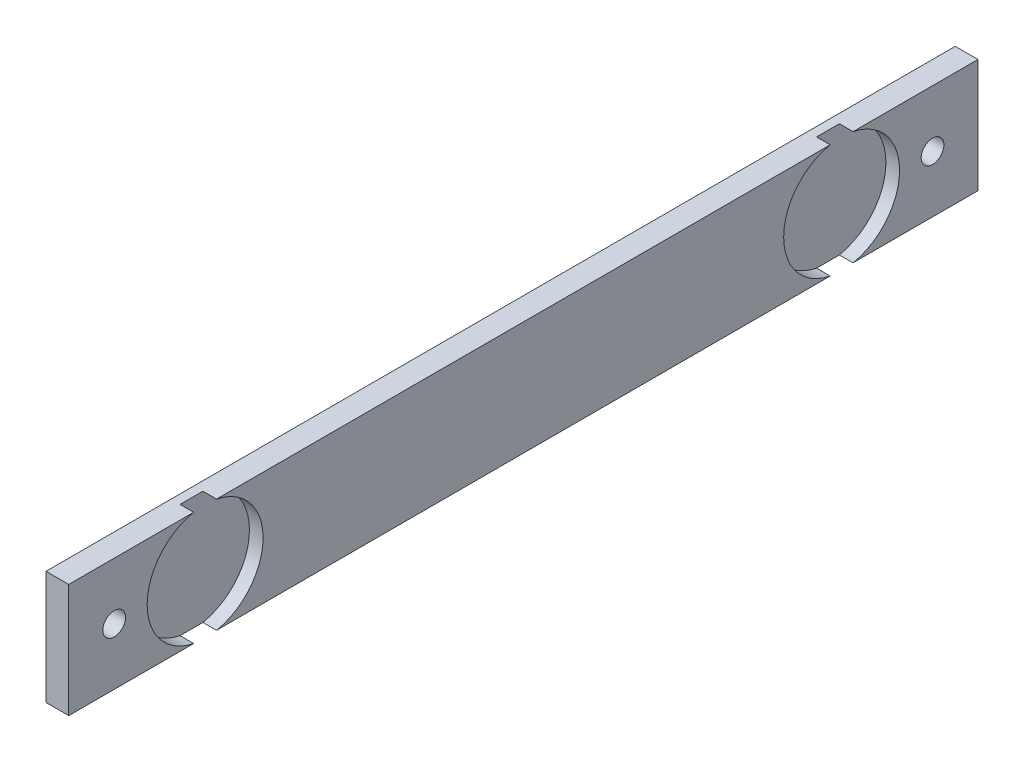
ISO-10303-21;
HEADER;
FILE_DESCRIPTION(('STEP AP214'),'2;1');
FILE_NAME('part.step','',(''),(''),'','','');
FILE_SCHEMA(('AUTOMOTIVE_DESIGN { 1 0 10303 214 1 1 1 1 }'));
ENDSEC;
DATA;
#1=APPLICATION_CONTEXT('core data for automotive mechanical design processes');
#2=APPLICATION_PROTOCOL_DEFINITION('international standard','automotive_design',2000,#1);
#3=PRODUCT_CONTEXT('',#1,'mechanical');
#4=PRODUCT('Part','Part','',(#3));
#5=PRODUCT_RELATED_PRODUCT_CATEGORY('part','',(#4));
#6=PRODUCT_DEFINITION_FORMATION('','',#4);
#7=PRODUCT_DEFINITION_CONTEXT('part definition',#1,'design');
#8=PRODUCT_DEFINITION('design','',#6,#7);
#9=PRODUCT_DEFINITION_SHAPE('','',#8);
#10=(LENGTH_UNIT() NAMED_UNIT(*) SI_UNIT(.MILLI.,.METRE.));
#11=(NAMED_UNIT(*) PLANE_ANGLE_UNIT() SI_UNIT($,.RADIAN.));
#12=(NAMED_UNIT(*) SI_UNIT($,.STERADIAN.) SOLID_ANGLE_UNIT());
#13=UNCERTAINTY_MEASURE_WITH_UNIT(LENGTH_MEASURE(1.E-05),#10,'distance_accuracy_value','');
#14=(GEOMETRIC_REPRESENTATION_CONTEXT(3) GLOBAL_UNCERTAINTY_ASSIGNED_CONTEXT((#13)) GLOBAL_UNIT_ASSIGNED_CONTEXT((#10,
#11,#12)) REPRESENTATION_CONTEXT('',''));
#15=CARTESIAN_POINT('',(0.,0.,0.));
#16=DIRECTION('',(0.,0.,1.));
#17=DIRECTION('',(1.,0.,0.));
#18=AXIS2_PLACEMENT_3D('',#15,#16,#17);
#19=CARTESIAN_POINT('',(2.,0.,0.));
#20=DIRECTION('',(1.,0.,0.));
#21=DIRECTION('',(0.,0.,-1.));
#22=AXIS2_PLACEMENT_3D('',#19,#20,#21);
#23=PLANE('',#22);
#24=CARTESIAN_POINT('',(2.,4.99999999999999,68.));
#25=DIRECTION('',(1.,0.,0.));
#26=DIRECTION('',(0.,0.,-1.));
#27=AXIS2_PLACEMENT_3D('',#24,#25,#26);
#28=CIRCLE('',#27,5.1);
#29=CARTESIAN_POINT('',(2.,9.99999999999998,69.0049875621121));
#30=VERTEX_POINT('',#29);
#31=CARTESIAN_POINT('',(2.,0.,69.004987562112));
#32=VERTEX_POINT('',#31);
#33=EDGE_CURVE('E204',#30,#32,#28,.T.);
#34=ORIENTED_EDGE('',*,*,#33,.F.);
#35=DIRECTION('',(0.,0.,1.));
#36=VECTOR('',#35,1.);
#37=CARTESIAN_POINT('',(2.,10.,0.));
#38=LINE('',#37,#36);
#39=CARTESIAN_POINT('',(2.,9.99999999999998,80.));
#40=VERTEX_POINT('',#39);
#41=EDGE_CURVE('E170',#30,#40,#38,.T.);
#42=ORIENTED_EDGE('',*,*,#41,.T.);
#43=DIRECTION('',(0.,-1.,0.));
#44=VECTOR('',#43,1.);
#45=CARTESIAN_POINT('',(2.,0.,80.));
#46=LINE('',#45,#44);
#47=CARTESIAN_POINT('',(2.,0.,80.));
#48=VERTEX_POINT('',#47);
#49=EDGE_CURVE('E174',#40,#48,#46,.T.);
#50=ORIENTED_EDGE('',*,*,#49,.T.);
#51=DIRECTION('',(0.,0.,-1.));
#52=VECTOR('',#51,1.);
#53=CARTESIAN_POINT('',(2.,0.,0.));
#54=LINE('',#53,#52);
#55=EDGE_CURVE('E178',#48,#32,#54,.T.);
#56=ORIENTED_EDGE('',*,*,#55,.T.);
#57=EDGE_LOOP('',(#34,#42,#50,#56));
#58=FACE_BOUND('',#57,.T.);
#59=CARTESIAN_POINT('',(2.,4.99999999999998,76.));
#60=DIRECTION('',(1.,0.,0.));
#61=DIRECTION('',(0.,0.,-1.));
#62=AXIS2_PLACEMENT_3D('',#59,#60,#61);
#63=CIRCLE('',#62,0.999999999999998);
#64=CARTESIAN_POINT('',(2.,4.99999999999998,75.));
#65=VERTEX_POINT('',#64);
#66=EDGE_CURVE('E159',#65,#65,#63,.T.);
#67=ORIENTED_EDGE('',*,*,#66,.F.);
#68=EDGE_LOOP('',(#67));
#69=FACE_BOUND('',#68,.T.);
#70=ADVANCED_FACE('F35',(#58,#69),#23,.T.);
#71=CARTESIAN_POINT('',(2.,0.,66.995012437888));
#72=VERTEX_POINT('',#71);
#73=CARTESIAN_POINT('',(2.,9.99999999999998,66.9950124378879));
#74=VERTEX_POINT('',#73);
#75=EDGE_CURVE('E203',#72,#74,#28,.T.);
#76=ORIENTED_EDGE('',*,*,#75,.F.);
#77=CARTESIAN_POINT('',(2.,0.,13.0049875621121));
#78=VERTEX_POINT('',#77);
#79=EDGE_CURVE('E182',#72,#78,#54,.T.);
#80=ORIENTED_EDGE('',*,*,#79,.T.);
#81=CARTESIAN_POINT('',(2.,5.,12.));
#82=DIRECTION('',(1.,0.,0.));
#83=DIRECTION('',(0.,0.,-1.));
#84=AXIS2_PLACEMENT_3D('',#81,#82,#83);
#85=CIRCLE('',#84,5.1);
#86=CARTESIAN_POINT('',(2.,9.99999999999999,13.0049875621121));
#87=VERTEX_POINT('',#86);
#88=EDGE_CURVE('E202',#87,#78,#85,.T.);
#89=ORIENTED_EDGE('',*,*,#88,.F.);
#90=EDGE_CURVE('E175',#87,#74,#38,.T.);
#91=ORIENTED_EDGE('',*,*,#90,.T.);
#92=EDGE_LOOP('',(#76,#80,#89,#91));
#93=FACE_BOUND('',#92,.T.);
#94=ADVANCED_FACE('F241',(#93),#23,.T.);
#95=CARTESIAN_POINT('',(2.,0.,0.));
#96=DIRECTION('',(0.,0.,1.));
#97=DIRECTION('',(0.,-1.,0.));
#98=AXIS2_PLACEMENT_3D('',#95,#96,#97);
#99=PLANE('',#98);
#100=DIRECTION('',(0.,1.,0.));
#101=VECTOR('',#100,1.);
#102=CARTESIAN_POINT('',(0.,0.,0.));
#103=LINE('',#102,#101);
#104=CARTESIAN_POINT('',(0.,0.,0.));
#105=VERTEX_POINT('',#104);
#106=CARTESIAN_POINT('',(0.,10.,0.));
#107=VERTEX_POINT('',#106);
#108=EDGE_CURVE('E158',#105,#107,#103,.T.);
#109=ORIENTED_EDGE('',*,*,#108,.T.);
#110=DIRECTION('',(-1.,0.,0.));
#111=VECTOR('',#110,1.);
#112=CARTESIAN_POINT('',(2.,10.,0.));
#113=LINE('',#112,#111);
#114=CARTESIAN_POINT('',(2.,10.,0.));
#115=VERTEX_POINT('',#114);
#116=EDGE_CURVE('E198',#115,#107,#113,.T.);
#117=ORIENTED_EDGE('',*,*,#116,.F.);
#118=DIRECTION('',(0.,1.,0.));
#119=VECTOR('',#118,1.);
#120=CARTESIAN_POINT('',(2.,0.,0.));
#121=LINE('',#120,#119);
#122=CARTESIAN_POINT('',(2.,0.,0.));
#123=VERTEX_POINT('',#122);
#124=EDGE_CURVE('E167',#123,#115,#121,.T.);
#125=ORIENTED_EDGE('',*,*,#124,.F.);
#126=DIRECTION('',(-1.,0.,0.));
#127=VECTOR('',#126,1.);
#128=CARTESIAN_POINT('',(2.,0.,0.));
#129=LINE('',#128,#127);
#130=EDGE_CURVE('E181',#123,#105,#129,.T.);
#131=ORIENTED_EDGE('',*,*,#130,.T.);
#132=EDGE_LOOP('',(#109,#117,#125,#131));
#133=FACE_BOUND('',#132,.T.);
#134=ADVANCED_FACE('F37',(#133),#99,.F.);
#135=CARTESIAN_POINT('',(2.,10.,0.));
#136=DIRECTION('',(0.,-1.,0.));
#137=DIRECTION('',(0.,0.,-1.));
#138=AXIS2_PLACEMENT_3D('',#135,#136,#137);
#139=PLANE('',#138);
#140=DIRECTION('',(0.,0.,1.));
#141=VECTOR('',#140,1.);
#142=CARTESIAN_POINT('',(0.8,10.,0.));
#143=LINE('',#142,#141);
#144=CARTESIAN_POINT('',(0.8,9.99999999999998,66.9950124378879));
#145=VERTEX_POINT('',#144);
#146=CARTESIAN_POINT('',(0.8,9.99999999999998,69.0049875621121));
#147=VERTEX_POINT('',#146);
#148=EDGE_CURVE('E145',#145,#147,#143,.T.);
#149=ORIENTED_EDGE('',*,*,#148,.F.);
#150=DIRECTION('',(1.,0.,0.));
#151=VECTOR('',#150,1.);
#152=CARTESIAN_POINT('',(0.8,9.99999999999998,66.9950124378879));
#153=LINE('',#152,#151);
#154=EDGE_CURVE('E146',#145,#74,#153,.T.);
#155=ORIENTED_EDGE('',*,*,#154,.T.);
#156=ORIENTED_EDGE('',*,*,#90,.F.);
#157=DIRECTION('',(1.,0.,0.));
#158=VECTOR('',#157,1.);
#159=CARTESIAN_POINT('',(0.8,9.99999999999999,13.0049875621121));
#160=LINE('',#159,#158);
#161=CARTESIAN_POINT('',(0.8,9.99999999999999,13.0049875621121));
#162=VERTEX_POINT('',#161);
#163=EDGE_CURVE('E131',#87,#162,#160,.F.);
#164=ORIENTED_EDGE('',*,*,#163,.T.);
#165=DIRECTION('',(0.,0.,1.));
#166=VECTOR('',#165,1.);
#167=CARTESIAN_POINT('',(0.8,10.,0.));
#168=LINE('',#167,#166);
#169=CARTESIAN_POINT('',(0.8,9.99999999999999,10.9950124378879));
#170=VERTEX_POINT('',#169);
#171=EDGE_CURVE('E136',#170,#162,#168,.T.);
#172=ORIENTED_EDGE('',*,*,#171,.F.);
#173=DIRECTION('',(1.,0.,0.));
#174=VECTOR('',#173,1.);
#175=CARTESIAN_POINT('',(0.8,9.99999999999999,10.9950124378879));
#176=LINE('',#175,#174);
#177=CARTESIAN_POINT('',(2.,9.99999999999999,10.9950124378879));
#178=VERTEX_POINT('',#177);
#179=EDGE_CURVE('E123',#170,#178,#176,.T.);
#180=ORIENTED_EDGE('',*,*,#179,.T.);
#181=EDGE_CURVE('E172',#115,#178,#38,.T.);
#182=ORIENTED_EDGE('',*,*,#181,.F.);
#183=ORIENTED_EDGE('',*,*,#116,.T.);
#184=DIRECTION('',(0.,0.,1.));
#185=VECTOR('',#184,1.);
#186=CARTESIAN_POINT('',(0.,10.,0.));
#187=LINE('',#186,#185);
#188=CARTESIAN_POINT('',(0.,9.99999999999998,80.));
#189=VERTEX_POINT('',#188);
#190=EDGE_CURVE('E185',#107,#189,#187,.T.);
#191=ORIENTED_EDGE('',*,*,#190,.T.);
#192=DIRECTION('',(-1.,0.,0.));
#193=VECTOR('',#192,1.);
#194=CARTESIAN_POINT('',(2.,9.99999999999998,80.));
#195=LINE('',#194,#193);
#196=EDGE_CURVE('E195',#40,#189,#195,.T.);
#197=ORIENTED_EDGE('',*,*,#196,.F.);
#198=ORIENTED_EDGE('',*,*,#41,.F.);
#199=DIRECTION('',(1.,0.,0.));
#200=VECTOR('',#199,1.);
#201=CARTESIAN_POINT('',(0.8,9.99999999999998,69.0049875621121));
#202=LINE('',#201,#200);
#203=EDGE_CURVE('E151',#30,#147,#202,.F.);
#204=ORIENTED_EDGE('',*,*,#203,.T.);
#205=EDGE_LOOP('',(#149,#155,#156,#164,#172,#180,#182,#183,#191,#197,#198,#204));
#206=FACE_BOUND('',#205,.T.);
#207=ADVANCED_FACE('F143',(#206),#139,.F.);
#208=CARTESIAN_POINT('',(2.,0.,80.));
#209=DIRECTION('',(0.,0.,-1.));
#210=DIRECTION('',(-1.,0.,0.));
#211=AXIS2_PLACEMENT_3D('',#208,#209,#210);
#212=PLANE('',#211);
#213=DIRECTION('',(0.,-1.,0.));
#214=VECTOR('',#213,1.);
#215=CARTESIAN_POINT('',(0.,0.,80.));
#216=LINE('',#215,#214);
#217=CARTESIAN_POINT('',(0.,0.,80.));
#218=VERTEX_POINT('',#217);
#219=EDGE_CURVE('E187',#189,#218,#216,.T.);
#220=ORIENTED_EDGE('',*,*,#219,.T.);
#221=DIRECTION('',(-1.,0.,0.));
#222=VECTOR('',#221,1.);
#223=CARTESIAN_POINT('',(2.,0.,80.));
#224=LINE('',#223,#222);
#225=EDGE_CURVE('E192',#48,#218,#224,.T.);
#226=ORIENTED_EDGE('',*,*,#225,.F.);
#227=ORIENTED_EDGE('',*,*,#49,.F.);
#228=ORIENTED_EDGE('',*,*,#196,.T.);
#229=EDGE_LOOP('',(#220,#226,#227,#228));
#230=FACE_BOUND('',#229,.T.);
#231=ADVANCED_FACE('F225',(#230),#212,.F.);
#232=CARTESIAN_POINT('',(2.,0.,0.));
#233=DIRECTION('',(0.,1.,0.));
#234=DIRECTION('',(0.,0.,1.));
#235=AXIS2_PLACEMENT_3D('',#232,#233,#234);
#236=PLANE('',#235);
#237=DIRECTION('',(0.,0.,-1.));
#238=VECTOR('',#237,1.);
#239=CARTESIAN_POINT('',(0.8,0.,0.));
#240=LINE('',#239,#238);
#241=CARTESIAN_POINT('',(0.8,0.,69.004987562112));
#242=VERTEX_POINT('',#241);
#243=CARTESIAN_POINT('',(0.8,0.,66.995012437888));
#244=VERTEX_POINT('',#243);
#245=EDGE_CURVE('E11',#242,#244,#240,.T.);
#246=ORIENTED_EDGE('',*,*,#245,.F.);
#247=DIRECTION('',(1.,0.,0.));
#248=VECTOR('',#247,1.);
#249=CARTESIAN_POINT('',(0.8,0.,69.004987562112));
#250=LINE('',#249,#248);
#251=EDGE_CURVE('E210',#242,#32,#250,.T.);
#252=ORIENTED_EDGE('',*,*,#251,.T.);
#253=ORIENTED_EDGE('',*,*,#55,.F.);
#254=ORIENTED_EDGE('',*,*,#225,.T.);
#255=DIRECTION('',(0.,0.,-1.));
#256=VECTOR('',#255,1.);
#257=CARTESIAN_POINT('',(0.,0.,0.));
#258=LINE('',#257,#256);
#259=EDGE_CURVE('E171',#218,#105,#258,.T.);
#260=ORIENTED_EDGE('',*,*,#259,.T.);
#261=ORIENTED_EDGE('',*,*,#130,.F.);
#262=CARTESIAN_POINT('',(2.,0.,10.9950124378879));
#263=VERTEX_POINT('',#262);
#264=EDGE_CURVE('E177',#263,#123,#54,.T.);
#265=ORIENTED_EDGE('',*,*,#264,.F.);
#266=DIRECTION('',(1.,0.,0.));
#267=VECTOR('',#266,1.);
#268=CARTESIAN_POINT('',(0.8,0.,10.9950124378879));
#269=LINE('',#268,#267);
#270=CARTESIAN_POINT('',(0.8,0.,10.9950124378879));
#271=VERTEX_POINT('',#270);
#272=EDGE_CURVE('E50',#263,#271,#269,.F.);
#273=ORIENTED_EDGE('',*,*,#272,.T.);
#274=DIRECTION('',(0.,0.,-1.));
#275=VECTOR('',#274,1.);
#276=CARTESIAN_POINT('',(0.8,0.,0.));
#277=LINE('',#276,#275);
#278=CARTESIAN_POINT('',(0.8,0.,13.0049875621121));
#279=VERTEX_POINT('',#278);
#280=EDGE_CURVE('E43',#279,#271,#277,.T.);
#281=ORIENTED_EDGE('',*,*,#280,.F.);
#282=DIRECTION('',(1.,0.,0.));
#283=VECTOR('',#282,1.);
#284=CARTESIAN_POINT('',(0.8,0.,13.0049875621121));
#285=LINE('',#284,#283);
#286=EDGE_CURVE('E244',#279,#78,#285,.T.);
#287=ORIENTED_EDGE('',*,*,#286,.T.);
#288=ORIENTED_EDGE('',*,*,#79,.F.);
#289=DIRECTION('',(1.,0.,0.));
#290=VECTOR('',#289,1.);
#291=CARTESIAN_POINT('',(0.8,0.,66.995012437888));
#292=LINE('',#291,#290);
#293=EDGE_CURVE('E58',#72,#244,#292,.F.);
#294=ORIENTED_EDGE('',*,*,#293,.T.);
#295=EDGE_LOOP('',(#246,#252,#253,#254,#260,#261,#265,#273,#281,#287,#288,#294));
#296=FACE_BOUND('',#295,.T.);
#297=ADVANCED_FACE('F218',(#296),#236,.F.);
#298=EDGE_CURVE('E127',#263,#178,#85,.T.);
#299=ORIENTED_EDGE('',*,*,#298,.F.);
#300=ORIENTED_EDGE('',*,*,#264,.T.);
#301=ORIENTED_EDGE('',*,*,#124,.T.);
#302=ORIENTED_EDGE('',*,*,#181,.T.);
#303=EDGE_LOOP('',(#299,#300,#301,#302));
#304=FACE_BOUND('',#303,.T.);
#305=CARTESIAN_POINT('',(2.,5.,4.));
#306=DIRECTION('',(1.,0.,0.));
#307=DIRECTION('',(0.,0.,-1.));
#308=AXIS2_PLACEMENT_3D('',#305,#306,#307);
#309=CIRCLE('',#308,1.);
#310=CARTESIAN_POINT('',(2.,5.,3.));
#311=VERTEX_POINT('',#310);
#312=EDGE_CURVE('E148',#311,#311,#309,.T.);
#313=ORIENTED_EDGE('',*,*,#312,.F.);
#314=EDGE_LOOP('',(#313));
#315=FACE_BOUND('',#314,.T.);
#316=ADVANCED_FACE('F269',(#304,#315),#23,.T.);
#317=CARTESIAN_POINT('',(0.,0.,0.));
#318=DIRECTION('',(1.,0.,0.));
#319=DIRECTION('',(0.,0.,-1.));
#320=AXIS2_PLACEMENT_3D('',#317,#318,#319);
#321=PLANE('',#320);
#322=CARTESIAN_POINT('',(0.,4.99999999999998,76.));
#323=DIRECTION('',(1.,0.,0.));
#324=DIRECTION('',(0.,0.,-1.));
#325=AXIS2_PLACEMENT_3D('',#322,#323,#324);
#326=CIRCLE('',#325,0.999999999999998);
#327=CARTESIAN_POINT('',(0.,4.99999999999998,75.));
#328=VERTEX_POINT('',#327);
#329=EDGE_CURVE('E155',#328,#328,#326,.T.);
#330=ORIENTED_EDGE('',*,*,#329,.T.);
#331=EDGE_LOOP('',(#330));
#332=FACE_BOUND('',#331,.T.);
#333=CARTESIAN_POINT('',(0.,5.,4.));
#334=DIRECTION('',(1.,0.,0.));
#335=DIRECTION('',(0.,0.,-1.));
#336=AXIS2_PLACEMENT_3D('',#333,#334,#335);
#337=CIRCLE('',#336,1.);
#338=CARTESIAN_POINT('',(0.,5.,3.));
#339=VERTEX_POINT('',#338);
#340=EDGE_CURVE('E162',#339,#339,#337,.T.);
#341=ORIENTED_EDGE('',*,*,#340,.T.);
#342=EDGE_LOOP('',(#341));
#343=FACE_BOUND('',#342,.T.);
#344=ORIENTED_EDGE('',*,*,#108,.F.);
#345=ORIENTED_EDGE('',*,*,#259,.F.);
#346=ORIENTED_EDGE('',*,*,#219,.F.);
#347=ORIENTED_EDGE('',*,*,#190,.F.);
#348=EDGE_LOOP('',(#344,#345,#346,#347));
#349=FACE_BOUND('',#348,.T.);
#350=ADVANCED_FACE('F231',(#332,#343,#349),#321,.F.);
#351=CARTESIAN_POINT('',(0.,5.,4.));
#352=DIRECTION('',(1.,0.,0.));
#353=DIRECTION('',(0.,0.,-1.));
#354=AXIS2_PLACEMENT_3D('',#351,#352,#353);
#355=CYLINDRICAL_SURFACE('',#354,1.);
#356=ORIENTED_EDGE('',*,*,#340,.F.);
#357=EDGE_LOOP('',(#356));
#358=FACE_BOUND('',#357,.T.);
#359=ORIENTED_EDGE('',*,*,#312,.T.);
#360=EDGE_LOOP('',(#359));
#361=FACE_BOUND('',#360,.T.);
#362=ADVANCED_FACE('F280',(#358,#361),#355,.F.);
#363=CARTESIAN_POINT('',(0.,4.99999999999998,76.));
#364=DIRECTION('',(1.,0.,0.));
#365=DIRECTION('',(0.,0.,-1.));
#366=AXIS2_PLACEMENT_3D('',#363,#364,#365);
#367=CYLINDRICAL_SURFACE('',#366,0.999999999999998);
#368=ORIENTED_EDGE('',*,*,#329,.F.);
#369=EDGE_LOOP('',(#368));
#370=FACE_BOUND('',#369,.T.);
#371=ORIENTED_EDGE('',*,*,#66,.T.);
#372=EDGE_LOOP('',(#371));
#373=FACE_BOUND('',#372,.T.);
#374=ADVANCED_FACE('F287',(#370,#373),#367,.F.);
#375=CARTESIAN_POINT('',(0.8,5.,12.));
#376=DIRECTION('',(1.,0.,0.));
#377=DIRECTION('',(0.,0.,-1.));
#378=AXIS2_PLACEMENT_3D('',#375,#376,#377);
#379=PLANE('',#378);
#380=ORIENTED_EDGE('',*,*,#171,.T.);
#381=CARTESIAN_POINT('',(0.8,5.,12.));
#382=DIRECTION('',(1.,0.,0.));
#383=DIRECTION('',(0.,0.,-1.));
#384=AXIS2_PLACEMENT_3D('',#381,#382,#383);
#385=CIRCLE('',#384,5.1);
#386=EDGE_CURVE('E139',#162,#279,#385,.T.);
#387=ORIENTED_EDGE('',*,*,#386,.T.);
#388=ORIENTED_EDGE('',*,*,#280,.T.);
#389=EDGE_CURVE('E126',#271,#170,#385,.T.);
#390=ORIENTED_EDGE('',*,*,#389,.T.);
#391=EDGE_LOOP('',(#380,#387,#388,#390));
#392=FACE_BOUND('',#391,.T.);
#393=ADVANCED_FACE('F134',(#392),#379,.T.);
#394=CARTESIAN_POINT('',(0.8,5.,12.));
#395=DIRECTION('',(1.,0.,0.));
#396=DIRECTION('',(0.,0.,-1.));
#397=AXIS2_PLACEMENT_3D('',#394,#395,#396);
#398=CYLINDRICAL_SURFACE('',#397,5.1);
#399=ORIENTED_EDGE('',*,*,#389,.F.);
#400=ORIENTED_EDGE('',*,*,#272,.F.);
#401=ORIENTED_EDGE('',*,*,#298,.T.);
#402=ORIENTED_EDGE('',*,*,#179,.F.);
#403=EDGE_LOOP('',(#399,#400,#401,#402));
#404=FACE_BOUND('',#403,.T.);
#405=ADVANCED_FACE('F125',(#404),#398,.F.);
#406=ORIENTED_EDGE('',*,*,#88,.T.);
#407=ORIENTED_EDGE('',*,*,#286,.F.);
#408=ORIENTED_EDGE('',*,*,#386,.F.);
#409=ORIENTED_EDGE('',*,*,#163,.F.);
#410=EDGE_LOOP('',(#406,#407,#408,#409));
#411=FACE_BOUND('',#410,.T.);
#412=ADVANCED_FACE('F257',(#411),#398,.F.);
#413=CARTESIAN_POINT('',(0.8,4.99999999999999,68.));
#414=DIRECTION('',(1.,0.,0.));
#415=DIRECTION('',(0.,0.,-1.));
#416=AXIS2_PLACEMENT_3D('',#413,#414,#415);
#417=PLANE('',#416);
#418=ORIENTED_EDGE('',*,*,#148,.T.);
#419=CARTESIAN_POINT('',(0.8,4.99999999999999,68.));
#420=DIRECTION('',(1.,0.,0.));
#421=DIRECTION('',(0.,0.,-1.));
#422=AXIS2_PLACEMENT_3D('',#419,#420,#421);
#423=CIRCLE('',#422,5.1);
#424=EDGE_CURVE('E248',#147,#242,#423,.T.);
#425=ORIENTED_EDGE('',*,*,#424,.T.);
#426=ORIENTED_EDGE('',*,*,#245,.T.);
#427=EDGE_CURVE('E253',#244,#145,#423,.T.);
#428=ORIENTED_EDGE('',*,*,#427,.T.);
#429=EDGE_LOOP('',(#418,#425,#426,#428));
#430=FACE_BOUND('',#429,.T.);
#431=ADVANCED_FACE('F255',(#430),#417,.T.);
#432=CARTESIAN_POINT('',(0.8,4.99999999999999,68.));
#433=DIRECTION('',(1.,0.,0.));
#434=DIRECTION('',(0.,0.,-1.));
#435=AXIS2_PLACEMENT_3D('',#432,#433,#434);
#436=CYLINDRICAL_SURFACE('',#435,5.1);
#437=ORIENTED_EDGE('',*,*,#427,.F.);
#438=ORIENTED_EDGE('',*,*,#293,.F.);
#439=ORIENTED_EDGE('',*,*,#75,.T.);
#440=ORIENTED_EDGE('',*,*,#154,.F.);
#441=EDGE_LOOP('',(#437,#438,#439,#440));
#442=FACE_BOUND('',#441,.T.);
#443=ADVANCED_FACE('F252',(#442),#436,.F.);
#444=ORIENTED_EDGE('',*,*,#33,.T.);
#445=ORIENTED_EDGE('',*,*,#251,.F.);
#446=ORIENTED_EDGE('',*,*,#424,.F.);
#447=ORIENTED_EDGE('',*,*,#203,.F.);
#448=EDGE_LOOP('',(#444,#445,#446,#447));
#449=FACE_BOUND('',#448,.T.);
#450=ADVANCED_FACE('F208',(#449),#436,.F.);
#451=CLOSED_SHELL('',(#70,#94,#134,#207,#231,#297,#316,#350,#362,#374,#393,#405,#412,#431,#443,#450));
#452=MANIFOLD_SOLID_BREP('B2',#451);
#453=ADVANCED_BREP_SHAPE_REPRESENTATION('',(#18,#452),#14);
#454=SHAPE_DEFINITION_REPRESENTATION(#9,#453);
ENDSEC;
END-ISO-10303-21;
